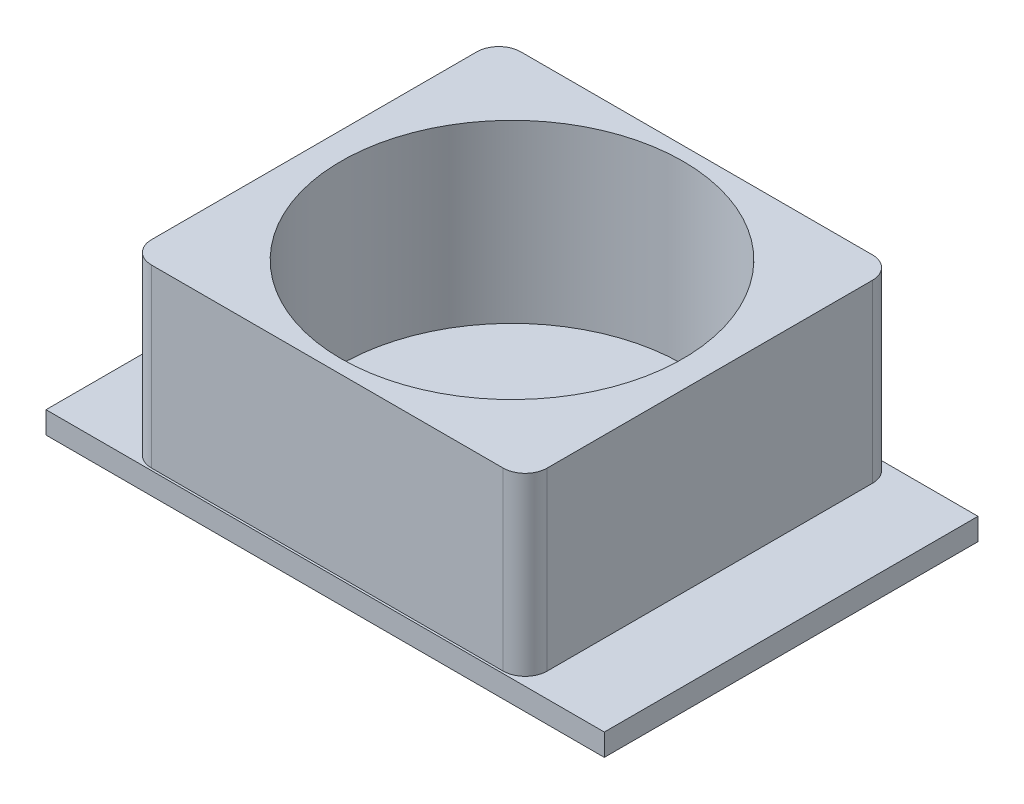
ISO-10303-21;
HEADER;
FILE_DESCRIPTION(('STEP AP214'),'2;1');
FILE_NAME('part.step','',(''),(''),'','','');
FILE_SCHEMA(('AUTOMOTIVE_DESIGN { 1 0 10303 214 1 1 1 1 }'));
ENDSEC;
DATA;
#1=APPLICATION_CONTEXT('core data for automotive mechanical design processes');
#2=APPLICATION_PROTOCOL_DEFINITION('international standard','automotive_design',2000,#1);
#3=PRODUCT_CONTEXT('',#1,'mechanical');
#4=PRODUCT('Part','Part','',(#3));
#5=PRODUCT_RELATED_PRODUCT_CATEGORY('part','',(#4));
#6=PRODUCT_DEFINITION_FORMATION('','',#4);
#7=PRODUCT_DEFINITION_CONTEXT('part definition',#1,'design');
#8=PRODUCT_DEFINITION('design','',#6,#7);
#9=PRODUCT_DEFINITION_SHAPE('','',#8);
#10=(LENGTH_UNIT() NAMED_UNIT(*) SI_UNIT(.MILLI.,.METRE.));
#11=(NAMED_UNIT(*) PLANE_ANGLE_UNIT() SI_UNIT($,.RADIAN.));
#12=(NAMED_UNIT(*) SI_UNIT($,.STERADIAN.) SOLID_ANGLE_UNIT());
#13=UNCERTAINTY_MEASURE_WITH_UNIT(LENGTH_MEASURE(1.E-05),#10,'distance_accuracy_value','');
#14=(GEOMETRIC_REPRESENTATION_CONTEXT(3) GLOBAL_UNCERTAINTY_ASSIGNED_CONTEXT((#13)) GLOBAL_UNIT_ASSIGNED_CONTEXT((#10,
#11,#12)) REPRESENTATION_CONTEXT('',''));
#15=CARTESIAN_POINT('',(0.,0.,0.));
#16=DIRECTION('',(0.,0.,1.));
#17=DIRECTION('',(1.,0.,0.));
#18=AXIS2_PLACEMENT_3D('',#15,#16,#17);
#19=CARTESIAN_POINT('',(0.,40.,0.));
#20=DIRECTION('',(0.,-1.,0.));
#21=DIRECTION('',(0.,0.,-1.));
#22=AXIS2_PLACEMENT_3D('',#19,#20,#21);
#23=PLANE('',#22);
#24=DIRECTION('',(-1.,0.,0.));
#25=VECTOR('',#24,1.);
#26=CARTESIAN_POINT('',(0.,40.,-84.));
#27=LINE('',#26,#25);
#28=CARTESIAN_POINT('',(85.,40.,-84.));
#29=VERTEX_POINT('',#28);
#30=CARTESIAN_POINT('',(5.,40.,-84.));
#31=VERTEX_POINT('',#30);
#32=EDGE_CURVE('E183',#29,#31,#27,.T.);
#33=ORIENTED_EDGE('',*,*,#32,.T.);
#34=CARTESIAN_POINT('',(5.,40.,-79.));
#35=DIRECTION('',(0.,-1.,0.));
#36=DIRECTION('',(0.,0.,-1.));
#37=AXIS2_PLACEMENT_3D('',#34,#35,#36);
#38=CIRCLE('',#37,5.);
#39=CARTESIAN_POINT('',(0.,40.,-79.));
#40=VERTEX_POINT('',#39);
#41=EDGE_CURVE('E211',#31,#40,#38,.F.);
#42=ORIENTED_EDGE('',*,*,#41,.T.);
#43=DIRECTION('',(0.,0.,1.));
#44=VECTOR('',#43,1.);
#45=CARTESIAN_POINT('',(0.,40.,0.));
#46=LINE('',#45,#44);
#47=CARTESIAN_POINT('',(0.,40.,-5.));
#48=VERTEX_POINT('',#47);
#49=EDGE_CURVE('E173',#40,#48,#46,.T.);
#50=ORIENTED_EDGE('',*,*,#49,.T.);
#51=CARTESIAN_POINT('',(5.,40.,-5.));
#52=DIRECTION('',(0.,-1.,0.));
#53=DIRECTION('',(0.,0.,-1.));
#54=AXIS2_PLACEMENT_3D('',#51,#52,#53);
#55=CIRCLE('',#54,5.);
#56=CARTESIAN_POINT('',(5.,40.,0.));
#57=VERTEX_POINT('',#56);
#58=EDGE_CURVE('E205',#48,#57,#55,.F.);
#59=ORIENTED_EDGE('',*,*,#58,.T.);
#60=DIRECTION('',(1.,0.,0.));
#61=VECTOR('',#60,1.);
#62=CARTESIAN_POINT('',(0.,40.,0.));
#63=LINE('',#62,#61);
#64=CARTESIAN_POINT('',(85.,40.,0.));
#65=VERTEX_POINT('',#64);
#66=EDGE_CURVE('E176',#57,#65,#63,.T.);
#67=ORIENTED_EDGE('',*,*,#66,.T.);
#68=CARTESIAN_POINT('',(85.,40.,-5.));
#69=DIRECTION('',(0.,-1.,0.));
#70=DIRECTION('',(0.,0.,-1.));
#71=AXIS2_PLACEMENT_3D('',#68,#69,#70);
#72=CIRCLE('',#71,5.);
#73=CARTESIAN_POINT('',(90.,40.,-5.));
#74=VERTEX_POINT('',#73);
#75=EDGE_CURVE('E207',#65,#74,#72,.F.);
#76=ORIENTED_EDGE('',*,*,#75,.T.);
#77=DIRECTION('',(0.,0.,-1.));
#78=VECTOR('',#77,1.);
#79=CARTESIAN_POINT('',(90.,40.,0.));
#80=LINE('',#79,#78);
#81=CARTESIAN_POINT('',(90.,40.,-79.));
#82=VERTEX_POINT('',#81);
#83=EDGE_CURVE('E180',#74,#82,#80,.T.);
#84=ORIENTED_EDGE('',*,*,#83,.T.);
#85=CARTESIAN_POINT('',(85.,40.,-79.));
#86=DIRECTION('',(0.,-1.,0.));
#87=DIRECTION('',(0.,0.,-1.));
#88=AXIS2_PLACEMENT_3D('',#85,#86,#87);
#89=CIRCLE('',#88,5.);
#90=EDGE_CURVE('E209',#82,#29,#89,.F.);
#91=ORIENTED_EDGE('',*,*,#90,.T.);
#92=EDGE_LOOP('',(#33,#42,#50,#59,#67,#76,#84,#91));
#93=FACE_BOUND('',#92,.T.);
#94=CARTESIAN_POINT('',(45.,40.,-42.));
#95=DIRECTION('',(0.,1.,0.));
#96=DIRECTION('',(0.,0.,1.));
#97=AXIS2_PLACEMENT_3D('',#94,#95,#96);
#98=CIRCLE('',#97,38.9);
#99=CARTESIAN_POINT('',(45.,40.,-3.10000000000003));
#100=VERTEX_POINT('',#99);
#101=EDGE_CURVE('E167',#100,#100,#98,.T.);
#102=ORIENTED_EDGE('',*,*,#101,.F.);
#103=EDGE_LOOP('',(#102));
#104=FACE_BOUND('',#103,.T.);
#105=ADVANCED_FACE('F36',(#93,#104),#23,.F.);
#106=CARTESIAN_POINT('',(0.,40.,0.));
#107=DIRECTION('',(1.,0.,0.));
#108=DIRECTION('',(0.,0.,-1.));
#109=AXIS2_PLACEMENT_3D('',#106,#107,#108);
#110=PLANE('',#109);
#111=ORIENTED_EDGE('',*,*,#49,.F.);
#112=DIRECTION('',(0.,-1.,0.));
#113=VECTOR('',#112,1.);
#114=CARTESIAN_POINT('',(0.,40.,-79.));
#115=LINE('',#114,#113);
#116=CARTESIAN_POINT('',(0.,0.,-79.));
#117=VERTEX_POINT('',#116);
#118=EDGE_CURVE('E197',#40,#117,#115,.T.);
#119=ORIENTED_EDGE('',*,*,#118,.T.);
#120=DIRECTION('',(0.,0.,1.));
#121=VECTOR('',#120,1.);
#122=CARTESIAN_POINT('',(0.,0.,0.));
#123=LINE('',#122,#121);
#124=CARTESIAN_POINT('',(0.,0.,-5.));
#125=VERTEX_POINT('',#124);
#126=EDGE_CURVE('E170',#117,#125,#123,.T.);
#127=ORIENTED_EDGE('',*,*,#126,.T.);
#128=DIRECTION('',(0.,-1.,0.));
#129=VECTOR('',#128,1.);
#130=CARTESIAN_POINT('',(0.,40.,-5.));
#131=LINE('',#130,#129);
#132=EDGE_CURVE('E186',#125,#48,#131,.F.);
#133=ORIENTED_EDGE('',*,*,#132,.T.);
#134=EDGE_LOOP('',(#111,#119,#127,#133));
#135=FACE_BOUND('',#134,.T.);
#136=ADVANCED_FACE('F251',(#135),#110,.F.);
#137=CARTESIAN_POINT('',(0.,40.,0.));
#138=DIRECTION('',(0.,0.,-1.));
#139=DIRECTION('',(-1.,0.,0.));
#140=AXIS2_PLACEMENT_3D('',#137,#138,#139);
#141=PLANE('',#140);
#142=DIRECTION('',(1.,0.,0.));
#143=VECTOR('',#142,1.);
#144=CARTESIAN_POINT('',(0.,0.,0.));
#145=LINE('',#144,#143);
#146=CARTESIAN_POINT('',(5.,0.,0.));
#147=VERTEX_POINT('',#146);
#148=CARTESIAN_POINT('',(85.,0.,0.));
#149=VERTEX_POINT('',#148);
#150=EDGE_CURVE('E189',#147,#149,#145,.T.);
#151=ORIENTED_EDGE('',*,*,#150,.T.);
#152=DIRECTION('',(0.,-1.,0.));
#153=VECTOR('',#152,1.);
#154=CARTESIAN_POINT('',(85.,40.,0.));
#155=LINE('',#154,#153);
#156=EDGE_CURVE('E220',#149,#65,#155,.F.);
#157=ORIENTED_EDGE('',*,*,#156,.T.);
#158=ORIENTED_EDGE('',*,*,#66,.F.);
#159=DIRECTION('',(0.,-1.,0.));
#160=VECTOR('',#159,1.);
#161=CARTESIAN_POINT('',(5.,40.,0.));
#162=LINE('',#161,#160);
#163=EDGE_CURVE('E218',#57,#147,#162,.T.);
#164=ORIENTED_EDGE('',*,*,#163,.T.);
#165=EDGE_LOOP('',(#151,#157,#158,#164));
#166=FACE_BOUND('',#165,.T.);
#167=ADVANCED_FACE('F255',(#166),#141,.F.);
#168=CARTESIAN_POINT('',(90.,40.,0.));
#169=DIRECTION('',(-1.,0.,0.));
#170=DIRECTION('',(0.,0.,1.));
#171=AXIS2_PLACEMENT_3D('',#168,#169,#170);
#172=PLANE('',#171);
#173=DIRECTION('',(0.,0.,-1.));
#174=VECTOR('',#173,1.);
#175=CARTESIAN_POINT('',(90.,0.,0.));
#176=LINE('',#175,#174);
#177=CARTESIAN_POINT('',(90.,0.,-5.));
#178=VERTEX_POINT('',#177);
#179=CARTESIAN_POINT('',(90.,0.,-79.));
#180=VERTEX_POINT('',#179);
#181=EDGE_CURVE('E191',#178,#180,#176,.T.);
#182=ORIENTED_EDGE('',*,*,#181,.T.);
#183=DIRECTION('',(0.,-1.,0.));
#184=VECTOR('',#183,1.);
#185=CARTESIAN_POINT('',(90.,40.,-79.));
#186=LINE('',#185,#184);
#187=EDGE_CURVE('E216',#180,#82,#186,.F.);
#188=ORIENTED_EDGE('',*,*,#187,.T.);
#189=ORIENTED_EDGE('',*,*,#83,.F.);
#190=DIRECTION('',(0.,-1.,0.));
#191=VECTOR('',#190,1.);
#192=CARTESIAN_POINT('',(90.,40.,-5.));
#193=LINE('',#192,#191);
#194=EDGE_CURVE('E213',#74,#178,#193,.T.);
#195=ORIENTED_EDGE('',*,*,#194,.T.);
#196=EDGE_LOOP('',(#182,#188,#189,#195));
#197=FACE_BOUND('',#196,.T.);
#198=ADVANCED_FACE('F233',(#197),#172,.F.);
#199=CARTESIAN_POINT('',(0.,40.,-84.));
#200=DIRECTION('',(0.,0.,1.));
#201=DIRECTION('',(1.,0.,0.));
#202=AXIS2_PLACEMENT_3D('',#199,#200,#201);
#203=PLANE('',#202);
#204=DIRECTION('',(-1.,0.,0.));
#205=VECTOR('',#204,1.);
#206=CARTESIAN_POINT('',(0.,0.,-84.));
#207=LINE('',#206,#205);
#208=CARTESIAN_POINT('',(85.,0.,-84.));
#209=VERTEX_POINT('',#208);
#210=CARTESIAN_POINT('',(5.,0.,-84.));
#211=VERTEX_POINT('',#210);
#212=EDGE_CURVE('E177',#209,#211,#207,.T.);
#213=ORIENTED_EDGE('',*,*,#212,.T.);
#214=DIRECTION('',(0.,-1.,0.));
#215=VECTOR('',#214,1.);
#216=CARTESIAN_POINT('',(5.,40.,-84.));
#217=LINE('',#216,#215);
#218=EDGE_CURVE('E203',#211,#31,#217,.F.);
#219=ORIENTED_EDGE('',*,*,#218,.T.);
#220=ORIENTED_EDGE('',*,*,#32,.F.);
#221=DIRECTION('',(0.,-1.,0.));
#222=VECTOR('',#221,1.);
#223=CARTESIAN_POINT('',(85.,40.,-84.));
#224=LINE('',#223,#222);
#225=EDGE_CURVE('E200',#29,#209,#224,.T.);
#226=ORIENTED_EDGE('',*,*,#225,.T.);
#227=EDGE_LOOP('',(#213,#219,#220,#226));
#228=FACE_BOUND('',#227,.T.);
#229=ADVANCED_FACE('F243',(#228),#203,.F.);
#230=CARTESIAN_POINT('',(45.,40.,-42.));
#231=DIRECTION('',(0.,-1.,0.));
#232=DIRECTION('',(0.,0.,-1.));
#233=AXIS2_PLACEMENT_3D('',#230,#231,#232);
#234=CYLINDRICAL_SURFACE('',#233,38.9);
#235=ORIENTED_EDGE('',*,*,#101,.T.);
#236=EDGE_LOOP('',(#235));
#237=FACE_BOUND('',#236,.T.);
#238=CARTESIAN_POINT('',(45.,0.,-42.));
#239=DIRECTION('',(0.,1.,0.));
#240=DIRECTION('',(0.,0.,1.));
#241=AXIS2_PLACEMENT_3D('',#238,#239,#240);
#242=CIRCLE('',#241,38.9);
#243=CARTESIAN_POINT('',(45.,0.,-3.10000000000003));
#244=VERTEX_POINT('',#243);
#245=EDGE_CURVE('E146',#244,#244,#242,.T.);
#246=ORIENTED_EDGE('',*,*,#245,.F.);
#247=EDGE_LOOP('',(#246));
#248=FACE_BOUND('',#247,.T.);
#249=ADVANCED_FACE('F273',(#237,#248),#234,.F.);
#250=CARTESIAN_POINT('',(0.,0.,0.));
#251=DIRECTION('',(0.,1.,0.));
#252=DIRECTION('',(0.,0.,1.));
#253=AXIS2_PLACEMENT_3D('',#250,#251,#252);
#254=PLANE('',#253);
#255=ORIENTED_EDGE('',*,*,#245,.T.);
#256=EDGE_LOOP('',(#255));
#257=FACE_BOUND('',#256,.T.);
#258=ADVANCED_FACE('F286',(#257),#254,.T.);
#259=CARTESIAN_POINT('',(-18.5,-5.,-84.5));
#260=DIRECTION('',(0.,0.,1.));
#261=DIRECTION('',(1.,0.,0.));
#262=AXIS2_PLACEMENT_3D('',#259,#260,#261);
#263=PLANE('',#262);
#264=DIRECTION('',(1.,0.,0.));
#265=VECTOR('',#264,1.);
#266=CARTESIAN_POINT('',(-18.5,0.,-84.5));
#267=LINE('',#266,#265);
#268=CARTESIAN_POINT('',(-18.5,0.,-84.5));
#269=VERTEX_POINT('',#268);
#270=CARTESIAN_POINT('',(108.5,0.,-84.5));
#271=VERTEX_POINT('',#270);
#272=EDGE_CURVE('E142',#269,#271,#267,.T.);
#273=ORIENTED_EDGE('',*,*,#272,.T.);
#274=DIRECTION('',(0.,1.,0.));
#275=VECTOR('',#274,1.);
#276=CARTESIAN_POINT('',(108.5,-5.,-84.5));
#277=LINE('',#276,#275);
#278=CARTESIAN_POINT('',(108.5,-5.,-84.5));
#279=VERTEX_POINT('',#278);
#280=EDGE_CURVE('E139',#279,#271,#277,.T.);
#281=ORIENTED_EDGE('',*,*,#280,.F.);
#282=DIRECTION('',(1.,0.,0.));
#283=VECTOR('',#282,1.);
#284=CARTESIAN_POINT('',(-18.5,-5.,-84.5));
#285=LINE('',#284,#283);
#286=CARTESIAN_POINT('',(-18.5,-5.,-84.5));
#287=VERTEX_POINT('',#286);
#288=EDGE_CURVE('E124',#287,#279,#285,.T.);
#289=ORIENTED_EDGE('',*,*,#288,.F.);
#290=DIRECTION('',(0.,1.,0.));
#291=VECTOR('',#290,1.);
#292=CARTESIAN_POINT('',(-18.5,-5.,-84.5));
#293=LINE('',#292,#291);
#294=EDGE_CURVE('E155',#287,#269,#293,.T.);
#295=ORIENTED_EDGE('',*,*,#294,.T.);
#296=EDGE_LOOP('',(#273,#281,#289,#295));
#297=FACE_BOUND('',#296,.T.);
#298=ADVANCED_FACE('F140',(#297),#263,.F.);
#299=CARTESIAN_POINT('',(108.5,-5.,0.49999999999998));
#300=DIRECTION('',(1.,0.,0.));
#301=DIRECTION('',(0.,0.,-1.));
#302=AXIS2_PLACEMENT_3D('',#299,#300,#301);
#303=PLANE('',#302);
#304=DIRECTION('',(0.,0.,-1.));
#305=VECTOR('',#304,1.);
#306=CARTESIAN_POINT('',(108.5,0.,0.49999999999998));
#307=LINE('',#306,#305);
#308=CARTESIAN_POINT('',(108.5,0.,0.49999999999998));
#309=VERTEX_POINT('',#308);
#310=EDGE_CURVE('E157',#309,#271,#307,.T.);
#311=ORIENTED_EDGE('',*,*,#310,.F.);
#312=DIRECTION('',(0.,1.,0.));
#313=VECTOR('',#312,1.);
#314=CARTESIAN_POINT('',(108.5,-5.,0.49999999999998));
#315=LINE('',#314,#313);
#316=CARTESIAN_POINT('',(108.5,-5.,0.49999999999998));
#317=VERTEX_POINT('',#316);
#318=EDGE_CURVE('E147',#317,#309,#315,.T.);
#319=ORIENTED_EDGE('',*,*,#318,.F.);
#320=DIRECTION('',(0.,0.,-1.));
#321=VECTOR('',#320,1.);
#322=CARTESIAN_POINT('',(108.5,-5.,0.49999999999998));
#323=LINE('',#322,#321);
#324=EDGE_CURVE('E129',#317,#279,#323,.T.);
#325=ORIENTED_EDGE('',*,*,#324,.T.);
#326=ORIENTED_EDGE('',*,*,#280,.T.);
#327=EDGE_LOOP('',(#311,#319,#325,#326));
#328=FACE_BOUND('',#327,.T.);
#329=ADVANCED_FACE('F149',(#328),#303,.T.);
#330=CARTESIAN_POINT('',(-18.5,-5.,0.49999999999998));
#331=DIRECTION('',(0.,0.,1.));
#332=DIRECTION('',(1.,0.,0.));
#333=AXIS2_PLACEMENT_3D('',#330,#331,#332);
#334=PLANE('',#333);
#335=DIRECTION('',(1.,0.,0.));
#336=VECTOR('',#335,1.);
#337=CARTESIAN_POINT('',(-18.5,0.,0.49999999999998));
#338=LINE('',#337,#336);
#339=CARTESIAN_POINT('',(-18.5,0.,0.49999999999998));
#340=VERTEX_POINT('',#339);
#341=EDGE_CURVE('E159',#340,#309,#338,.T.);
#342=ORIENTED_EDGE('',*,*,#341,.F.);
#343=DIRECTION('',(0.,1.,0.));
#344=VECTOR('',#343,1.);
#345=CARTESIAN_POINT('',(-18.5,-5.,0.49999999999998));
#346=LINE('',#345,#344);
#347=CARTESIAN_POINT('',(-18.5,-5.,0.49999999999998));
#348=VERTEX_POINT('',#347);
#349=EDGE_CURVE('E164',#348,#340,#346,.T.);
#350=ORIENTED_EDGE('',*,*,#349,.F.);
#351=DIRECTION('',(1.,0.,0.));
#352=VECTOR('',#351,1.);
#353=CARTESIAN_POINT('',(-18.5,-5.,0.49999999999998));
#354=LINE('',#353,#352);
#355=EDGE_CURVE('E150',#348,#317,#354,.T.);
#356=ORIENTED_EDGE('',*,*,#355,.T.);
#357=ORIENTED_EDGE('',*,*,#318,.T.);
#358=EDGE_LOOP('',(#342,#350,#356,#357));
#359=FACE_BOUND('',#358,.T.);
#360=ADVANCED_FACE('F341',(#359),#334,.T.);
#361=CARTESIAN_POINT('',(-18.5,-5.,0.49999999999998));
#362=DIRECTION('',(1.,0.,0.));
#363=DIRECTION('',(0.,0.,-1.));
#364=AXIS2_PLACEMENT_3D('',#361,#362,#363);
#365=PLANE('',#364);
#366=DIRECTION('',(0.,0.,-1.));
#367=VECTOR('',#366,1.);
#368=CARTESIAN_POINT('',(-18.5,0.,0.49999999999998));
#369=LINE('',#368,#367);
#370=EDGE_CURVE('E136',#340,#269,#369,.T.);
#371=ORIENTED_EDGE('',*,*,#370,.T.);
#372=ORIENTED_EDGE('',*,*,#294,.F.);
#373=DIRECTION('',(0.,0.,-1.));
#374=VECTOR('',#373,1.);
#375=CARTESIAN_POINT('',(-18.5,-5.,0.49999999999998));
#376=LINE('',#375,#374);
#377=EDGE_CURVE('E132',#348,#287,#376,.T.);
#378=ORIENTED_EDGE('',*,*,#377,.F.);
#379=ORIENTED_EDGE('',*,*,#349,.T.);
#380=EDGE_LOOP('',(#371,#372,#378,#379));
#381=FACE_BOUND('',#380,.T.);
#382=ADVANCED_FACE('F290',(#381),#365,.F.);
#383=CARTESIAN_POINT('',(0.,-5.,0.));
#384=DIRECTION('',(0.,1.,0.));
#385=DIRECTION('',(0.,0.,1.));
#386=AXIS2_PLACEMENT_3D('',#383,#384,#385);
#387=PLANE('',#386);
#388=ORIENTED_EDGE('',*,*,#288,.T.);
#389=ORIENTED_EDGE('',*,*,#324,.F.);
#390=ORIENTED_EDGE('',*,*,#355,.F.);
#391=ORIENTED_EDGE('',*,*,#377,.T.);
#392=EDGE_LOOP('',(#388,#389,#390,#391));
#393=FACE_BOUND('',#392,.T.);
#394=ADVANCED_FACE('F126',(#393),#387,.F.);
#395=ORIENTED_EDGE('',*,*,#126,.F.);
#396=CARTESIAN_POINT('',(5.,0.,-79.));
#397=DIRECTION('',(0.,1.,0.));
#398=DIRECTION('',(0.,0.,1.));
#399=AXIS2_PLACEMENT_3D('',#396,#397,#398);
#400=CIRCLE('',#399,5.);
#401=EDGE_CURVE('E222',#117,#211,#400,.F.);
#402=ORIENTED_EDGE('',*,*,#401,.T.);
#403=ORIENTED_EDGE('',*,*,#212,.F.);
#404=CARTESIAN_POINT('',(85.,0.,-79.));
#405=DIRECTION('',(0.,1.,0.));
#406=DIRECTION('',(0.,0.,1.));
#407=AXIS2_PLACEMENT_3D('',#404,#405,#406);
#408=CIRCLE('',#407,5.);
#409=EDGE_CURVE('E224',#209,#180,#408,.F.);
#410=ORIENTED_EDGE('',*,*,#409,.T.);
#411=ORIENTED_EDGE('',*,*,#181,.F.);
#412=CARTESIAN_POINT('',(85.,0.,-5.));
#413=DIRECTION('',(0.,1.,0.));
#414=DIRECTION('',(0.,0.,1.));
#415=AXIS2_PLACEMENT_3D('',#412,#413,#414);
#416=CIRCLE('',#415,5.);
#417=EDGE_CURVE('E44',#178,#149,#416,.F.);
#418=ORIENTED_EDGE('',*,*,#417,.T.);
#419=ORIENTED_EDGE('',*,*,#150,.F.);
#420=CARTESIAN_POINT('',(5.,0.,-5.));
#421=DIRECTION('',(0.,1.,0.));
#422=DIRECTION('',(0.,0.,1.));
#423=AXIS2_PLACEMENT_3D('',#420,#421,#422);
#424=CIRCLE('',#423,5.);
#425=EDGE_CURVE('E11',#147,#125,#424,.F.);
#426=ORIENTED_EDGE('',*,*,#425,.T.);
#427=EDGE_LOOP('',(#395,#402,#403,#410,#411,#418,#419,#426));
#428=FACE_BOUND('',#427,.T.);
#429=ORIENTED_EDGE('',*,*,#272,.F.);
#430=ORIENTED_EDGE('',*,*,#370,.F.);
#431=ORIENTED_EDGE('',*,*,#341,.T.);
#432=ORIENTED_EDGE('',*,*,#310,.T.);
#433=EDGE_LOOP('',(#429,#430,#431,#432));
#434=FACE_BOUND('',#433,.T.);
#435=ADVANCED_FACE('F227',(#428,#434),#254,.T.);
#436=CARTESIAN_POINT('',(5.,40.,-79.));
#437=DIRECTION('',(0.,-1.,0.));
#438=DIRECTION('',(0.,0.,-1.));
#439=AXIS2_PLACEMENT_3D('',#436,#437,#438);
#440=CYLINDRICAL_SURFACE('',#439,5.);
#441=ORIENTED_EDGE('',*,*,#41,.F.);
#442=ORIENTED_EDGE('',*,*,#218,.F.);
#443=ORIENTED_EDGE('',*,*,#401,.F.);
#444=ORIENTED_EDGE('',*,*,#118,.F.);
#445=EDGE_LOOP('',(#441,#442,#443,#444));
#446=FACE_BOUND('',#445,.T.);
#447=ADVANCED_FACE('F246',(#446),#440,.T.);
#448=CARTESIAN_POINT('',(85.,40.,-79.));
#449=DIRECTION('',(0.,-1.,0.));
#450=DIRECTION('',(0.,0.,-1.));
#451=AXIS2_PLACEMENT_3D('',#448,#449,#450);
#452=CYLINDRICAL_SURFACE('',#451,5.);
#453=ORIENTED_EDGE('',*,*,#90,.F.);
#454=ORIENTED_EDGE('',*,*,#187,.F.);
#455=ORIENTED_EDGE('',*,*,#409,.F.);
#456=ORIENTED_EDGE('',*,*,#225,.F.);
#457=EDGE_LOOP('',(#453,#454,#455,#456));
#458=FACE_BOUND('',#457,.T.);
#459=ADVANCED_FACE('F237',(#458),#452,.T.);
#460=CARTESIAN_POINT('',(85.,40.,-5.));
#461=DIRECTION('',(0.,-1.,0.));
#462=DIRECTION('',(0.,0.,-1.));
#463=AXIS2_PLACEMENT_3D('',#460,#461,#462);
#464=CYLINDRICAL_SURFACE('',#463,5.);
#465=ORIENTED_EDGE('',*,*,#75,.F.);
#466=ORIENTED_EDGE('',*,*,#156,.F.);
#467=ORIENTED_EDGE('',*,*,#417,.F.);
#468=ORIENTED_EDGE('',*,*,#194,.F.);
#469=EDGE_LOOP('',(#465,#466,#467,#468));
#470=FACE_BOUND('',#469,.T.);
#471=ADVANCED_FACE('F258',(#470),#464,.T.);
#472=CARTESIAN_POINT('',(5.,40.,-5.));
#473=DIRECTION('',(0.,-1.,0.));
#474=DIRECTION('',(0.,0.,-1.));
#475=AXIS2_PLACEMENT_3D('',#472,#473,#474);
#476=CYLINDRICAL_SURFACE('',#475,5.);
#477=ORIENTED_EDGE('',*,*,#58,.F.);
#478=ORIENTED_EDGE('',*,*,#132,.F.);
#479=ORIENTED_EDGE('',*,*,#425,.F.);
#480=ORIENTED_EDGE('',*,*,#163,.F.);
#481=EDGE_LOOP('',(#477,#478,#479,#480));
#482=FACE_BOUND('',#481,.T.);
#483=ADVANCED_FACE('F38',(#482),#476,.T.);
#484=CLOSED_SHELL('',(#105,#136,#167,#198,#229,#249,#258,#298,#329,#360,#382,#394,#435,#447,
#459,#471,#483));
#485=MANIFOLD_SOLID_BREP('B2',#484);
#486=ADVANCED_BREP_SHAPE_REPRESENTATION('',(#18,#485),#14);
#487=SHAPE_DEFINITION_REPRESENTATION(#9,#486);
ENDSEC;
END-ISO-10303-21;
